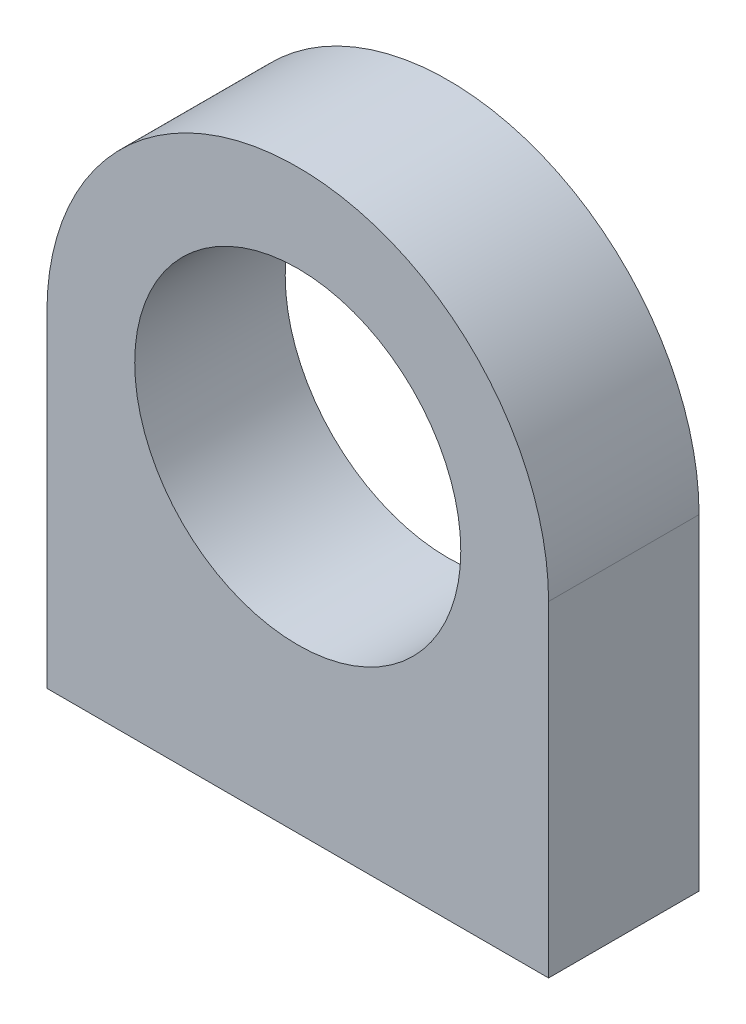
ISO-10303-21;
HEADER;
FILE_DESCRIPTION(('STEP AP214'),'2;1');
FILE_NAME('part.step','',(''),(''),'','','');
FILE_SCHEMA(('AUTOMOTIVE_DESIGN { 1 0 10303 214 1 1 1 1 }'));
ENDSEC;
DATA;
#1=APPLICATION_CONTEXT('core data for automotive mechanical design processes');
#2=APPLICATION_PROTOCOL_DEFINITION('international standard','automotive_design',2000,#1);
#3=PRODUCT_CONTEXT('',#1,'mechanical');
#4=PRODUCT('Part','Part','',(#3));
#5=PRODUCT_RELATED_PRODUCT_CATEGORY('part','',(#4));
#6=PRODUCT_DEFINITION_FORMATION('','',#4);
#7=PRODUCT_DEFINITION_CONTEXT('part definition',#1,'design');
#8=PRODUCT_DEFINITION('design','',#6,#7);
#9=PRODUCT_DEFINITION_SHAPE('','',#8);
#10=(LENGTH_UNIT() NAMED_UNIT(*) SI_UNIT(.MILLI.,.METRE.));
#11=(NAMED_UNIT(*) PLANE_ANGLE_UNIT() SI_UNIT($,.RADIAN.));
#12=(NAMED_UNIT(*) SI_UNIT($,.STERADIAN.) SOLID_ANGLE_UNIT());
#13=UNCERTAINTY_MEASURE_WITH_UNIT(LENGTH_MEASURE(1.E-05),#10,'distance_accuracy_value','');
#14=(GEOMETRIC_REPRESENTATION_CONTEXT(3) GLOBAL_UNCERTAINTY_ASSIGNED_CONTEXT((#13)) GLOBAL_UNIT_ASSIGNED_CONTEXT((#10,
#11,#12)) REPRESENTATION_CONTEXT('',''));
#15=CARTESIAN_POINT('',(0.,0.,0.));
#16=DIRECTION('',(0.,0.,1.));
#17=DIRECTION('',(1.,0.,0.));
#18=AXIS2_PLACEMENT_3D('',#15,#16,#17);
#19=CARTESIAN_POINT('',(7.,-13.,0.));
#20=DIRECTION('',(0.,1.,0.));
#21=DIRECTION('',(1.,0.,0.));
#22=AXIS2_PLACEMENT_3D('',#19,#20,#21);
#23=CYLINDRICAL_SURFACE('',#22,1.25);
#24=CARTESIAN_POINT('',(7.,-13.,0.));
#25=DIRECTION('',(0.,1.,0.));
#26=DIRECTION('',(1.,0.,0.));
#27=AXIS2_PLACEMENT_3D('',#24,#25,#26);
#28=CIRCLE('',#27,1.25);
#29=CARTESIAN_POINT('',(8.25,-13.,0.));
#30=VERTEX_POINT('',#29);
#31=CARTESIAN_POINT('',(5.75,-13.,0.));
#32=VERTEX_POINT('',#31);
#33=EDGE_CURVE('E41',#30,#32,#28,.T.);
#34=ORIENTED_EDGE('',*,*,#33,.F.);
#35=CARTESIAN_POINT('',(7.,-13.,0.));
#36=DIRECTION('',(0.,1.,0.));
#37=DIRECTION('',(1.,0.,0.));
#38=AXIS2_PLACEMENT_3D('',#35,#36,#37);
#39=CIRCLE('',#38,1.25);
#40=EDGE_CURVE('E200',#32,#30,#39,.T.);
#41=ORIENTED_EDGE('',*,*,#40,.F.);
#42=DIRECTION('',(0.,1.,0.));
#43=VECTOR('',#42,1.);
#44=CARTESIAN_POINT('',(5.75,-13.,0.));
#45=LINE('',#44,#43);
#46=CARTESIAN_POINT('',(5.75,-8.,0.));
#47=VERTEX_POINT('',#46);
#48=EDGE_CURVE('E11',#32,#47,#45,.T.);
#49=ORIENTED_EDGE('',*,*,#48,.T.);
#50=CARTESIAN_POINT('',(7.,-8.,0.));
#51=DIRECTION('',(0.,1.,0.));
#52=DIRECTION('',(1.,0.,0.));
#53=AXIS2_PLACEMENT_3D('',#50,#51,#52);
#54=CIRCLE('',#53,1.25);
#55=CARTESIAN_POINT('',(8.25,-8.,0.));
#56=VERTEX_POINT('',#55);
#57=EDGE_CURVE('E27',#47,#56,#54,.T.);
#58=ORIENTED_EDGE('',*,*,#57,.T.);
#59=CARTESIAN_POINT('',(7.,-8.,0.));
#60=DIRECTION('',(0.,1.,0.));
#61=DIRECTION('',(1.,0.,0.));
#62=AXIS2_PLACEMENT_3D('',#59,#60,#61);
#63=CIRCLE('',#62,1.25);
#64=EDGE_CURVE('E170',#56,#47,#63,.T.);
#65=ORIENTED_EDGE('',*,*,#64,.T.);
#66=ORIENTED_EDGE('',*,*,#48,.F.);
#67=EDGE_LOOP('',(#34,#41,#49,#58,#65,#66));
#68=FACE_BOUND('',#67,.T.);
#69=ADVANCED_FACE('F16',(#68),#23,.F.);
#70=CARTESIAN_POINT('',(7.,-8.,0.));
#71=DIRECTION('',(0.,-1.,0.));
#72=DIRECTION('',(0.,0.,-1.));
#73=AXIS2_PLACEMENT_3D('',#70,#71,#72);
#74=PLANE('',#73);
#75=ORIENTED_EDGE('',*,*,#64,.F.);
#76=ORIENTED_EDGE('',*,*,#57,.F.);
#77=EDGE_LOOP('',(#75,#76));
#78=FACE_BOUND('',#77,.T.);
#79=ADVANCED_FACE('F233',(#78),#74,.T.);
#80=CARTESIAN_POINT('',(0.,-13.,0.));
#81=DIRECTION('',(0.,1.,0.));
#82=DIRECTION('',(1.,0.,0.));
#83=AXIS2_PLACEMENT_3D('',#80,#81,#82);
#84=CYLINDRICAL_SURFACE('',#83,2.);
#85=CARTESIAN_POINT('',(0.,-13.,0.));
#86=DIRECTION('',(0.,1.,0.));
#87=DIRECTION('',(1.,0.,0.));
#88=AXIS2_PLACEMENT_3D('',#85,#86,#87);
#89=CIRCLE('',#88,2.);
#90=CARTESIAN_POINT('',(2.,-13.,0.));
#91=VERTEX_POINT('',#90);
#92=CARTESIAN_POINT('',(-2.,-13.,0.));
#93=VERTEX_POINT('',#92);
#94=EDGE_CURVE('E175',#91,#93,#89,.T.);
#95=ORIENTED_EDGE('',*,*,#94,.F.);
#96=CARTESIAN_POINT('',(0.,-13.,0.));
#97=DIRECTION('',(0.,1.,0.));
#98=DIRECTION('',(1.,0.,0.));
#99=AXIS2_PLACEMENT_3D('',#96,#97,#98);
#100=CIRCLE('',#99,2.);
#101=EDGE_CURVE('E171',#93,#91,#100,.T.);
#102=ORIENTED_EDGE('',*,*,#101,.F.);
#103=DIRECTION('',(0.,1.,0.));
#104=VECTOR('',#103,1.);
#105=CARTESIAN_POINT('',(-2.,-13.,0.));
#106=LINE('',#105,#104);
#107=CARTESIAN_POINT('',(-2.,-8.,0.));
#108=VERTEX_POINT('',#107);
#109=EDGE_CURVE('E166',#93,#108,#106,.T.);
#110=ORIENTED_EDGE('',*,*,#109,.T.);
#111=CARTESIAN_POINT('',(0.,-8.,0.));
#112=DIRECTION('',(0.,1.,0.));
#113=DIRECTION('',(1.,0.,0.));
#114=AXIS2_PLACEMENT_3D('',#111,#112,#113);
#115=CIRCLE('',#114,2.);
#116=CARTESIAN_POINT('',(2.,-8.,0.));
#117=VERTEX_POINT('',#116);
#118=EDGE_CURVE('E156',#108,#117,#115,.T.);
#119=ORIENTED_EDGE('',*,*,#118,.T.);
#120=CARTESIAN_POINT('',(0.,-8.,0.));
#121=DIRECTION('',(0.,1.,0.));
#122=DIRECTION('',(1.,0.,0.));
#123=AXIS2_PLACEMENT_3D('',#120,#121,#122);
#124=CIRCLE('',#123,2.);
#125=EDGE_CURVE('E183',#117,#108,#124,.T.);
#126=ORIENTED_EDGE('',*,*,#125,.T.);
#127=ORIENTED_EDGE('',*,*,#109,.F.);
#128=EDGE_LOOP('',(#95,#102,#110,#119,#126,#127));
#129=FACE_BOUND('',#128,.T.);
#130=ADVANCED_FACE('F311',(#129),#84,.F.);
#131=CARTESIAN_POINT('',(0.,-8.,0.));
#132=DIRECTION('',(0.,-1.,0.));
#133=DIRECTION('',(0.,0.,-1.));
#134=AXIS2_PLACEMENT_3D('',#131,#132,#133);
#135=PLANE('',#134);
#136=ORIENTED_EDGE('',*,*,#125,.F.);
#137=ORIENTED_EDGE('',*,*,#118,.F.);
#138=EDGE_LOOP('',(#136,#137));
#139=FACE_BOUND('',#138,.T.);
#140=ADVANCED_FACE('F271',(#139),#135,.T.);
#141=CARTESIAN_POINT('',(-7.,-13.,0.));
#142=DIRECTION('',(0.,1.,0.));
#143=DIRECTION('',(1.,0.,0.));
#144=AXIS2_PLACEMENT_3D('',#141,#142,#143);
#145=CYLINDRICAL_SURFACE('',#144,1.25);
#146=CARTESIAN_POINT('',(-7.,-13.,0.));
#147=DIRECTION('',(0.,1.,0.));
#148=DIRECTION('',(1.,0.,0.));
#149=AXIS2_PLACEMENT_3D('',#146,#147,#148);
#150=CIRCLE('',#149,1.25);
#151=CARTESIAN_POINT('',(-5.75,-13.,0.));
#152=VERTEX_POINT('',#151);
#153=CARTESIAN_POINT('',(-8.25,-13.,0.));
#154=VERTEX_POINT('',#153);
#155=EDGE_CURVE('E20',#152,#154,#150,.T.);
#156=ORIENTED_EDGE('',*,*,#155,.F.);
#157=CARTESIAN_POINT('',(-7.,-13.,0.));
#158=DIRECTION('',(0.,1.,0.));
#159=DIRECTION('',(1.,0.,0.));
#160=AXIS2_PLACEMENT_3D('',#157,#158,#159);
#161=CIRCLE('',#160,1.25);
#162=EDGE_CURVE('E158',#154,#152,#161,.T.);
#163=ORIENTED_EDGE('',*,*,#162,.F.);
#164=DIRECTION('',(0.,1.,0.));
#165=VECTOR('',#164,1.);
#166=CARTESIAN_POINT('',(-8.25,-13.,0.));
#167=LINE('',#166,#165);
#168=CARTESIAN_POINT('',(-8.25,-8.,0.));
#169=VERTEX_POINT('',#168);
#170=EDGE_CURVE('E179',#154,#169,#167,.T.);
#171=ORIENTED_EDGE('',*,*,#170,.T.);
#172=CARTESIAN_POINT('',(-7.,-8.,0.));
#173=DIRECTION('',(0.,1.,0.));
#174=DIRECTION('',(1.,0.,0.));
#175=AXIS2_PLACEMENT_3D('',#172,#173,#174);
#176=CIRCLE('',#175,1.25);
#177=CARTESIAN_POINT('',(-5.75,-8.,0.));
#178=VERTEX_POINT('',#177);
#179=EDGE_CURVE('E184',#169,#178,#176,.T.);
#180=ORIENTED_EDGE('',*,*,#179,.T.);
#181=CARTESIAN_POINT('',(-7.,-8.,0.));
#182=DIRECTION('',(0.,1.,0.));
#183=DIRECTION('',(1.,0.,0.));
#184=AXIS2_PLACEMENT_3D('',#181,#182,#183);
#185=CIRCLE('',#184,1.25);
#186=EDGE_CURVE('E187',#178,#169,#185,.T.);
#187=ORIENTED_EDGE('',*,*,#186,.T.);
#188=ORIENTED_EDGE('',*,*,#170,.F.);
#189=EDGE_LOOP('',(#156,#163,#171,#180,#187,#188));
#190=FACE_BOUND('',#189,.T.);
#191=ADVANCED_FACE('F246',(#190),#145,.F.);
#192=CARTESIAN_POINT('',(-7.,-8.,0.));
#193=DIRECTION('',(0.,-1.,0.));
#194=DIRECTION('',(0.,0.,-1.));
#195=AXIS2_PLACEMENT_3D('',#192,#193,#194);
#196=PLANE('',#195);
#197=ORIENTED_EDGE('',*,*,#186,.F.);
#198=ORIENTED_EDGE('',*,*,#179,.F.);
#199=EDGE_LOOP('',(#197,#198));
#200=FACE_BOUND('',#199,.T.);
#201=ADVANCED_FACE('F248',(#200),#196,.T.);
#202=CARTESIAN_POINT('',(0.,-1.5,-3.));
#203=DIRECTION('',(0.,0.,1.));
#204=DIRECTION('',(1.,0.,0.));
#205=AXIS2_PLACEMENT_3D('',#202,#203,#204);
#206=PLANE('',#205);
#207=DIRECTION('',(0.,1.,0.));
#208=VECTOR('',#207,1.);
#209=CARTESIAN_POINT('',(-10.,0.,-3.));
#210=LINE('',#209,#208);
#211=CARTESIAN_POINT('',(-10.,-13.,-3.));
#212=VERTEX_POINT('',#211);
#213=CARTESIAN_POINT('',(-10.,0.,-3.));
#214=VERTEX_POINT('',#213);
#215=EDGE_CURVE('E135',#212,#214,#210,.T.);
#216=ORIENTED_EDGE('',*,*,#215,.T.);
#217=CARTESIAN_POINT('',(0.,0.,-3.));
#218=DIRECTION('',(0.,0.,-1.));
#219=DIRECTION('',(1.,0.,0.));
#220=AXIS2_PLACEMENT_3D('',#217,#218,#219);
#221=CIRCLE('',#220,10.);
#222=CARTESIAN_POINT('',(10.,0.,-3.));
#223=VERTEX_POINT('',#222);
#224=EDGE_CURVE('E128',#214,#223,#221,.T.);
#225=ORIENTED_EDGE('',*,*,#224,.T.);
#226=DIRECTION('',(0.,-1.,0.));
#227=VECTOR('',#226,1.);
#228=CARTESIAN_POINT('',(10.,-13.,-3.));
#229=LINE('',#228,#227);
#230=CARTESIAN_POINT('',(10.,-13.,-3.));
#231=VERTEX_POINT('',#230);
#232=EDGE_CURVE('E118',#223,#231,#229,.T.);
#233=ORIENTED_EDGE('',*,*,#232,.T.);
#234=DIRECTION('',(-1.,0.,0.));
#235=VECTOR('',#234,1.);
#236=CARTESIAN_POINT('',(-10.,-13.,-3.));
#237=LINE('',#236,#235);
#238=EDGE_CURVE('E129',#231,#212,#237,.T.);
#239=ORIENTED_EDGE('',*,*,#238,.T.);
#240=EDGE_LOOP('',(#216,#225,#233,#239));
#241=FACE_BOUND('',#240,.T.);
#242=CARTESIAN_POINT('',(0.,0.,-3.));
#243=DIRECTION('',(0.,0.,1.));
#244=DIRECTION('',(-1.,0.,0.));
#245=AXIS2_PLACEMENT_3D('',#242,#243,#244);
#246=CIRCLE('',#245,6.5);
#247=CARTESIAN_POINT('',(6.5,0.,-3.));
#248=VERTEX_POINT('',#247);
#249=EDGE_CURVE('E151',#248,#248,#246,.T.);
#250=ORIENTED_EDGE('',*,*,#249,.T.);
#251=EDGE_LOOP('',(#250));
#252=FACE_BOUND('',#251,.T.);
#253=ADVANCED_FACE('F132',(#241,#252),#206,.F.);
#254=CARTESIAN_POINT('',(0.,0.,0.));
#255=DIRECTION('',(0.,0.,1.));
#256=DIRECTION('',(-1.,0.,0.));
#257=AXIS2_PLACEMENT_3D('',#254,#255,#256);
#258=CYLINDRICAL_SURFACE('',#257,6.5);
#259=CARTESIAN_POINT('',(0.,0.,3.));
#260=DIRECTION('',(0.,0.,-1.));
#261=DIRECTION('',(-1.,0.,0.));
#262=AXIS2_PLACEMENT_3D('',#259,#260,#261);
#263=CIRCLE('',#262,6.5);
#264=CARTESIAN_POINT('',(6.5,0.,3.));
#265=VERTEX_POINT('',#264);
#266=EDGE_CURVE('E201',#265,#265,#263,.T.);
#267=ORIENTED_EDGE('',*,*,#266,.F.);
#268=DIRECTION('',(0.,0.,-1.));
#269=VECTOR('',#268,1.);
#270=CARTESIAN_POINT('',(6.5,0.,0.));
#271=LINE('',#270,#269);
#272=EDGE_CURVE('E144',#265,#248,#271,.T.);
#273=ORIENTED_EDGE('',*,*,#272,.T.);
#274=ORIENTED_EDGE('',*,*,#249,.F.);
#275=ORIENTED_EDGE('',*,*,#272,.F.);
#276=EDGE_LOOP('',(#267,#273,#274,#275));
#277=FACE_BOUND('',#276,.T.);
#278=ADVANCED_FACE('F18',(#277),#258,.F.);
#279=CARTESIAN_POINT('',(0.,0.,0.));
#280=DIRECTION('',(0.,0.,1.));
#281=DIRECTION('',(1.,0.,0.));
#282=AXIS2_PLACEMENT_3D('',#279,#280,#281);
#283=CYLINDRICAL_SURFACE('',#282,10.);
#284=DIRECTION('',(0.,0.,-1.));
#285=VECTOR('',#284,1.);
#286=CARTESIAN_POINT('',(-10.,0.,0.));
#287=LINE('',#286,#285);
#288=CARTESIAN_POINT('',(-10.,0.,3.));
#289=VERTEX_POINT('',#288);
#290=EDGE_CURVE('E188',#289,#214,#287,.T.);
#291=ORIENTED_EDGE('',*,*,#290,.F.);
#292=CARTESIAN_POINT('',(0.,0.,3.));
#293=DIRECTION('',(0.,0.,1.));
#294=DIRECTION('',(1.,0.,0.));
#295=AXIS2_PLACEMENT_3D('',#292,#293,#294);
#296=CIRCLE('',#295,10.);
#297=CARTESIAN_POINT('',(10.,0.,3.));
#298=VERTEX_POINT('',#297);
#299=EDGE_CURVE('E142',#298,#289,#296,.T.);
#300=ORIENTED_EDGE('',*,*,#299,.F.);
#301=DIRECTION('',(0.,0.,1.));
#302=VECTOR('',#301,1.);
#303=CARTESIAN_POINT('',(10.,0.,0.));
#304=LINE('',#303,#302);
#305=EDGE_CURVE('E122',#223,#298,#304,.T.);
#306=ORIENTED_EDGE('',*,*,#305,.F.);
#307=ORIENTED_EDGE('',*,*,#224,.F.);
#308=EDGE_LOOP('',(#291,#300,#306,#307));
#309=FACE_BOUND('',#308,.T.);
#310=ADVANCED_FACE('F141',(#309),#283,.T.);
#311=CARTESIAN_POINT('',(10.,-13.,0.));
#312=DIRECTION('',(1.,0.,0.));
#313=DIRECTION('',(0.,1.,0.));
#314=AXIS2_PLACEMENT_3D('',#311,#312,#313);
#315=PLANE('',#314);
#316=ORIENTED_EDGE('',*,*,#305,.T.);
#317=DIRECTION('',(0.,1.,0.));
#318=VECTOR('',#317,1.);
#319=CARTESIAN_POINT('',(10.,-13.,3.));
#320=LINE('',#319,#318);
#321=CARTESIAN_POINT('',(10.,-13.,3.));
#322=VERTEX_POINT('',#321);
#323=EDGE_CURVE('E162',#322,#298,#320,.T.);
#324=ORIENTED_EDGE('',*,*,#323,.F.);
#325=DIRECTION('',(0.,0.,1.));
#326=VECTOR('',#325,1.);
#327=CARTESIAN_POINT('',(10.,-13.,0.));
#328=LINE('',#327,#326);
#329=EDGE_CURVE('E125',#231,#322,#328,.T.);
#330=ORIENTED_EDGE('',*,*,#329,.F.);
#331=ORIENTED_EDGE('',*,*,#232,.F.);
#332=EDGE_LOOP('',(#316,#324,#330,#331));
#333=FACE_BOUND('',#332,.T.);
#334=ADVANCED_FACE('F120',(#333),#315,.T.);
#335=CARTESIAN_POINT('',(-10.,-13.,0.));
#336=DIRECTION('',(0.,-1.,0.));
#337=DIRECTION('',(0.,0.,-1.));
#338=AXIS2_PLACEMENT_3D('',#335,#336,#337);
#339=PLANE('',#338);
#340=ORIENTED_EDGE('',*,*,#329,.T.);
#341=DIRECTION('',(1.,0.,0.));
#342=VECTOR('',#341,1.);
#343=CARTESIAN_POINT('',(-10.,-13.,3.));
#344=LINE('',#343,#342);
#345=CARTESIAN_POINT('',(-10.,-13.,3.));
#346=VERTEX_POINT('',#345);
#347=EDGE_CURVE('E165',#346,#322,#344,.T.);
#348=ORIENTED_EDGE('',*,*,#347,.F.);
#349=DIRECTION('',(0.,0.,1.));
#350=VECTOR('',#349,1.);
#351=CARTESIAN_POINT('',(-10.,-13.,0.));
#352=LINE('',#351,#350);
#353=EDGE_CURVE('E161',#212,#346,#352,.T.);
#354=ORIENTED_EDGE('',*,*,#353,.F.);
#355=ORIENTED_EDGE('',*,*,#238,.F.);
#356=EDGE_LOOP('',(#340,#348,#354,#355));
#357=FACE_BOUND('',#356,.T.);
#358=ORIENTED_EDGE('',*,*,#33,.T.);
#359=ORIENTED_EDGE('',*,*,#40,.T.);
#360=EDGE_LOOP('',(#358,#359));
#361=FACE_BOUND('',#360,.T.);
#362=ORIENTED_EDGE('',*,*,#94,.T.);
#363=ORIENTED_EDGE('',*,*,#101,.T.);
#364=EDGE_LOOP('',(#362,#363));
#365=FACE_BOUND('',#364,.T.);
#366=ORIENTED_EDGE('',*,*,#155,.T.);
#367=ORIENTED_EDGE('',*,*,#162,.T.);
#368=EDGE_LOOP('',(#366,#367));
#369=FACE_BOUND('',#368,.T.);
#370=ADVANCED_FACE('F227',(#357,#361,#365,#369),#339,.T.);
#371=CARTESIAN_POINT('',(-10.,0.,0.));
#372=DIRECTION('',(-1.,0.,0.));
#373=DIRECTION('',(0.,0.,1.));
#374=AXIS2_PLACEMENT_3D('',#371,#372,#373);
#375=PLANE('',#374);
#376=ORIENTED_EDGE('',*,*,#353,.T.);
#377=DIRECTION('',(0.,-1.,0.));
#378=VECTOR('',#377,1.);
#379=CARTESIAN_POINT('',(-10.,0.,3.));
#380=LINE('',#379,#378);
#381=EDGE_CURVE('E191',#289,#346,#380,.T.);
#382=ORIENTED_EDGE('',*,*,#381,.F.);
#383=ORIENTED_EDGE('',*,*,#290,.T.);
#384=ORIENTED_EDGE('',*,*,#215,.F.);
#385=EDGE_LOOP('',(#376,#382,#383,#384));
#386=FACE_BOUND('',#385,.T.);
#387=ADVANCED_FACE('F289',(#386),#375,.T.);
#388=CARTESIAN_POINT('',(0.,-1.5,3.));
#389=DIRECTION('',(0.,0.,1.));
#390=DIRECTION('',(1.,0.,0.));
#391=AXIS2_PLACEMENT_3D('',#388,#389,#390);
#392=PLANE('',#391);
#393=ORIENTED_EDGE('',*,*,#381,.T.);
#394=ORIENTED_EDGE('',*,*,#347,.T.);
#395=ORIENTED_EDGE('',*,*,#323,.T.);
#396=ORIENTED_EDGE('',*,*,#299,.T.);
#397=EDGE_LOOP('',(#393,#394,#395,#396));
#398=FACE_BOUND('',#397,.T.);
#399=ORIENTED_EDGE('',*,*,#266,.T.);
#400=EDGE_LOOP('',(#399));
#401=FACE_BOUND('',#400,.T.);
#402=ADVANCED_FACE('F285',(#398,#401),#392,.T.);
#403=CLOSED_SHELL('',(#69,#79,#130,#140,#191,#201,#253,#278,#310,#334,#370,#387,#402));
#404=MANIFOLD_SOLID_BREP('B1',#403);
#405=ADVANCED_BREP_SHAPE_REPRESENTATION('',(#18,#404),#14);
#406=SHAPE_DEFINITION_REPRESENTATION(#9,#405);
ENDSEC;
END-ISO-10303-21;
